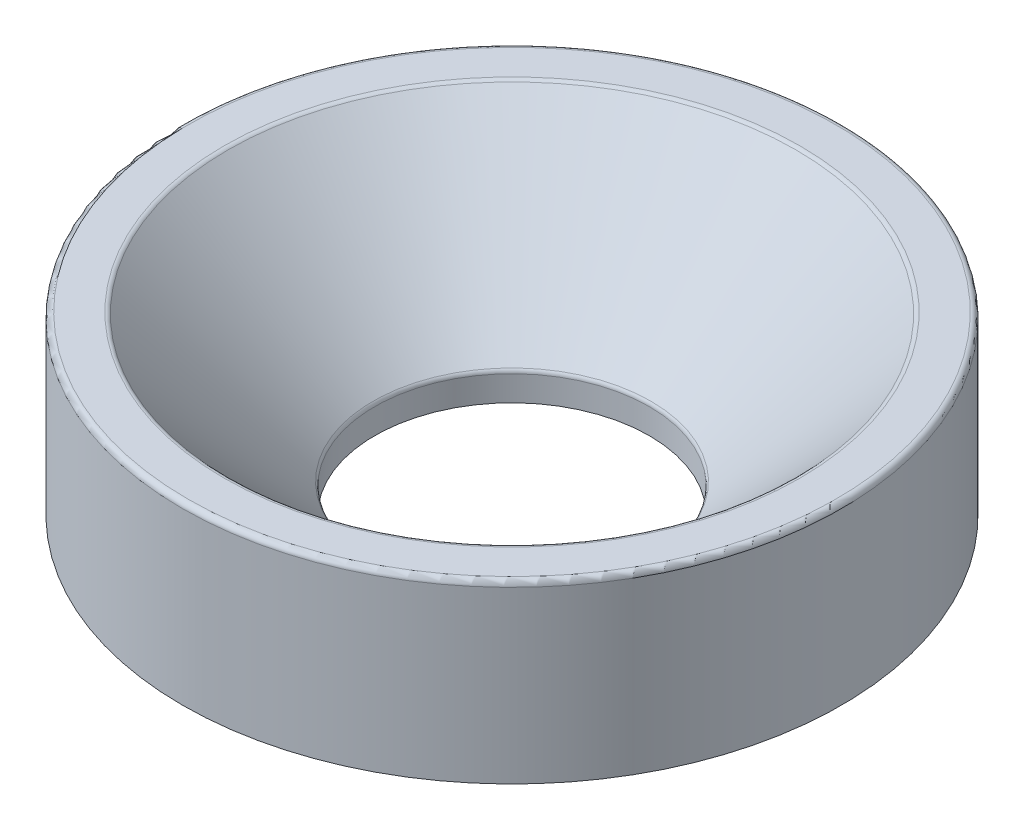
ISO-10303-21;
HEADER;
FILE_DESCRIPTION(('STEP AP214'),'2;1');
FILE_NAME('part.step','',(''),(''),'','','');
FILE_SCHEMA(('AUTOMOTIVE_DESIGN { 1 0 10303 214 1 1 1 1 }'));
ENDSEC;
DATA;
#1=APPLICATION_CONTEXT('core data for automotive mechanical design processes');
#2=APPLICATION_PROTOCOL_DEFINITION('international standard','automotive_design',2000,#1);
#3=PRODUCT_CONTEXT('',#1,'mechanical');
#4=PRODUCT('Part','Part','',(#3));
#5=PRODUCT_RELATED_PRODUCT_CATEGORY('part','',(#4));
#6=PRODUCT_DEFINITION_FORMATION('','',#4);
#7=PRODUCT_DEFINITION_CONTEXT('part definition',#1,'design');
#8=PRODUCT_DEFINITION('design','',#6,#7);
#9=PRODUCT_DEFINITION_SHAPE('','',#8);
#10=(LENGTH_UNIT() NAMED_UNIT(*) SI_UNIT(.MILLI.,.METRE.));
#11=(NAMED_UNIT(*) PLANE_ANGLE_UNIT() SI_UNIT($,.RADIAN.));
#12=(NAMED_UNIT(*) SI_UNIT($,.STERADIAN.) SOLID_ANGLE_UNIT());
#13=UNCERTAINTY_MEASURE_WITH_UNIT(LENGTH_MEASURE(1.E-05),#10,'distance_accuracy_value','');
#14=(GEOMETRIC_REPRESENTATION_CONTEXT(3) GLOBAL_UNCERTAINTY_ASSIGNED_CONTEXT((#13)) GLOBAL_UNIT_ASSIGNED_CONTEXT((#10,
#11,#12)) REPRESENTATION_CONTEXT('',''));
#15=CARTESIAN_POINT('',(0.,0.,0.));
#16=DIRECTION('',(0.,0.,1.));
#17=DIRECTION('',(1.,0.,0.));
#18=AXIS2_PLACEMENT_3D('',#15,#16,#17);
#19=CARTESIAN_POINT('',(0.,3.2,0.));
#20=DIRECTION('',(0.,1.,0.));
#21=DIRECTION('',(0.,0.,1.));
#22=AXIS2_PLACEMENT_3D('',#19,#20,#21);
#23=PLANE('',#22);
#24=CARTESIAN_POINT('',(0.,3.2,0.));
#25=DIRECTION('',(0.,1.,0.));
#26=DIRECTION('',(0.,0.,1.));
#27=AXIS2_PLACEMENT_3D('',#24,#25,#26);
#28=CIRCLE('',#27,5.9);
#29=CARTESIAN_POINT('',(0.,3.2,5.9));
#30=VERTEX_POINT('',#29);
#31=EDGE_CURVE('E65',#30,#30,#28,.T.);
#32=ORIENTED_EDGE('',*,*,#31,.T.);
#33=EDGE_LOOP('',(#32));
#34=FACE_BOUND('',#33,.T.);
#35=CARTESIAN_POINT('',(0.,3.2,0.));
#36=DIRECTION('',(0.,1.,0.));
#37=DIRECTION('',(0.,0.,1.));
#38=AXIS2_PLACEMENT_3D('',#35,#36,#37);
#39=CIRCLE('',#38,5.24142135623732);
#40=CARTESIAN_POINT('',(0.,3.2,5.24142135623732));
#41=VERTEX_POINT('',#40);
#42=EDGE_CURVE('E69',#41,#41,#39,.F.);
#43=ORIENTED_EDGE('',*,*,#42,.T.);
#44=EDGE_LOOP('',(#43));
#45=FACE_BOUND('',#44,.T.);
#46=ADVANCED_FACE('F41',(#34,#45),#23,.T.);
#47=CARTESIAN_POINT('',(0.,0.,0.));
#48=DIRECTION('',(0.,1.,0.));
#49=DIRECTION('',(0.,0.,1.));
#50=AXIS2_PLACEMENT_3D('',#47,#48,#49);
#51=PLANE('',#50);
#52=CARTESIAN_POINT('',(0.,0.,0.));
#53=DIRECTION('',(0.,1.,0.));
#54=DIRECTION('',(0.,0.,1.));
#55=AXIS2_PLACEMENT_3D('',#52,#53,#54);
#56=CIRCLE('',#55,6.);
#57=CARTESIAN_POINT('',(0.,0.,6.));
#58=VERTEX_POINT('',#57);
#59=EDGE_CURVE('E73',#58,#58,#56,.T.);
#60=ORIENTED_EDGE('',*,*,#59,.F.);
#61=EDGE_LOOP('',(#60));
#62=FACE_BOUND('',#61,.T.);
#63=CARTESIAN_POINT('',(0.,0.,0.));
#64=DIRECTION('',(0.,1.,0.));
#65=DIRECTION('',(0.,0.,1.));
#66=AXIS2_PLACEMENT_3D('',#63,#64,#65);
#67=CIRCLE('',#66,2.5);
#68=CARTESIAN_POINT('',(0.,0.,2.5));
#69=VERTEX_POINT('',#68);
#70=EDGE_CURVE('E77',#69,#69,#67,.T.);
#71=ORIENTED_EDGE('',*,*,#70,.T.);
#72=EDGE_LOOP('',(#71));
#73=FACE_BOUND('',#72,.T.);
#74=ADVANCED_FACE('F82',(#62,#73),#51,.F.);
#75=CARTESIAN_POINT('',(0.,3.2,0.));
#76=DIRECTION('',(0.,-1.,0.));
#77=DIRECTION('',(0.,0.,-1.));
#78=AXIS2_PLACEMENT_3D('',#75,#76,#77);
#79=CYLINDRICAL_SURFACE('',#78,6.);
#80=CARTESIAN_POINT('',(0.,3.1,0.));
#81=DIRECTION('',(0.,1.,0.));
#82=DIRECTION('',(0.,0.,1.));
#83=AXIS2_PLACEMENT_3D('',#80,#81,#82);
#84=CIRCLE('',#83,6.);
#85=CARTESIAN_POINT('',(0.,3.1,6.));
#86=VERTEX_POINT('',#85);
#87=EDGE_CURVE('E59',#86,#86,#84,.F.);
#88=ORIENTED_EDGE('',*,*,#87,.T.);
#89=EDGE_LOOP('',(#88));
#90=FACE_BOUND('',#89,.T.);
#91=ORIENTED_EDGE('',*,*,#59,.T.);
#92=EDGE_LOOP('',(#91));
#93=FACE_BOUND('',#92,.T.);
#94=ADVANCED_FACE('F87',(#90,#93),#79,.T.);
#95=CARTESIAN_POINT('',(0.,3.2,0.));
#96=DIRECTION('',(0.,-1.,0.));
#97=DIRECTION('',(0.,0.,-1.));
#98=AXIS2_PLACEMENT_3D('',#95,#96,#97);
#99=CYLINDRICAL_SURFACE('',#98,2.5);
#100=CARTESIAN_POINT('',(0.,0.458578643762691,0.));
#101=DIRECTION('',(0.,-1.,0.));
#102=DIRECTION('',(0.,0.,-1.));
#103=AXIS2_PLACEMENT_3D('',#100,#101,#102);
#104=CIRCLE('',#103,2.5);
#105=CARTESIAN_POINT('',(0.,0.458578643762691,-2.5));
#106=VERTEX_POINT('',#105);
#107=EDGE_CURVE('E10',#106,#106,#104,.F.);
#108=ORIENTED_EDGE('',*,*,#107,.T.);
#109=EDGE_LOOP('',(#108));
#110=FACE_BOUND('',#109,.T.);
#111=ORIENTED_EDGE('',*,*,#70,.F.);
#112=EDGE_LOOP('',(#111));
#113=FACE_BOUND('',#112,.T.);
#114=ADVANCED_FACE('F84',(#110,#113),#99,.F.);
#115=CARTESIAN_POINT('',(0.,0.500000000000001,0.));
#116=DIRECTION('',(0.,1.,0.));
#117=DIRECTION('',(0.,0.,1.));
#118=AXIS2_PLACEMENT_3D('',#115,#116,#117);
#119=CONICAL_SURFACE('',#118,2.5,0.78539816339745);
#120=CARTESIAN_POINT('',(0.,3.17071067811866,0.));
#121=DIRECTION('',(0.,-1.,0.));
#122=DIRECTION('',(0.,0.,-1.));
#123=AXIS2_PLACEMENT_3D('',#120,#121,#122);
#124=CIRCLE('',#123,5.17071067811866);
#125=CARTESIAN_POINT('',(0.,3.17071067811866,-5.17071067811866));
#126=VERTEX_POINT('',#125);
#127=EDGE_CURVE('E49',#126,#126,#124,.F.);
#128=ORIENTED_EDGE('',*,*,#127,.T.);
#129=EDGE_LOOP('',(#128));
#130=FACE_BOUND('',#129,.T.);
#131=CARTESIAN_POINT('',(0.,0.529289321881346,0.));
#132=DIRECTION('',(0.,-1.,0.));
#133=DIRECTION('',(0.,0.,-1.));
#134=AXIS2_PLACEMENT_3D('',#131,#132,#133);
#135=CIRCLE('',#134,2.52928932188135);
#136=CARTESIAN_POINT('',(0.,0.529289321881346,-2.52928932188135));
#137=VERTEX_POINT('',#136);
#138=EDGE_CURVE('E54',#137,#137,#135,.T.);
#139=ORIENTED_EDGE('',*,*,#138,.T.);
#140=EDGE_LOOP('',(#139));
#141=FACE_BOUND('',#140,.T.);
#142=ADVANCED_FACE('F86',(#130,#141),#119,.F.);
#143=CARTESIAN_POINT('',(0.,3.1,0.));
#144=DIRECTION('',(0.,1.,0.));
#145=DIRECTION('',(0.,0.,1.));
#146=AXIS2_PLACEMENT_3D('',#143,#144,#145);
#147=TOROIDAL_SURFACE('',#146,5.9,0.1);
#148=ORIENTED_EDGE('',*,*,#87,.F.);
#149=EDGE_LOOP('',(#148));
#150=FACE_BOUND('',#149,.T.);
#151=ORIENTED_EDGE('',*,*,#31,.F.);
#152=EDGE_LOOP('',(#151));
#153=FACE_BOUND('',#152,.T.);
#154=ADVANCED_FACE('F93',(#150,#153),#147,.T.);
#155=CARTESIAN_POINT('',(0.,3.1,0.));
#156=DIRECTION('',(0.,1.,0.));
#157=DIRECTION('',(0.,0.,1.));
#158=AXIS2_PLACEMENT_3D('',#155,#156,#157);
#159=TOROIDAL_SURFACE('',#158,5.24142135623732,0.1);
#160=ORIENTED_EDGE('',*,*,#127,.F.);
#161=EDGE_LOOP('',(#160));
#162=FACE_BOUND('',#161,.T.);
#163=ORIENTED_EDGE('',*,*,#42,.F.);
#164=EDGE_LOOP('',(#163));
#165=FACE_BOUND('',#164,.T.);
#166=ADVANCED_FACE('F111',(#162,#165),#159,.T.);
#167=CARTESIAN_POINT('',(0.,0.458578643762692,0.));
#168=DIRECTION('',(0.,-1.,0.));
#169=DIRECTION('',(0.,0.,-1.));
#170=AXIS2_PLACEMENT_3D('',#167,#168,#169);
#171=TOROIDAL_SURFACE('',#170,2.6,0.1);
#172=ORIENTED_EDGE('',*,*,#138,.F.);
#173=EDGE_LOOP('',(#172));
#174=FACE_BOUND('',#173,.T.);
#175=ORIENTED_EDGE('',*,*,#107,.F.);
#176=EDGE_LOOP('',(#175));
#177=FACE_BOUND('',#176,.T.);
#178=ADVANCED_FACE('F43',(#174,#177),#171,.T.);
#179=CLOSED_SHELL('',(#46,#74,#94,#114,#142,#154,#166,#178));
#180=MANIFOLD_SOLID_BREP('B2',#179);
#181=ADVANCED_BREP_SHAPE_REPRESENTATION('',(#18,#180),#14);
#182=SHAPE_DEFINITION_REPRESENTATION(#9,#181);
ENDSEC;
END-ISO-10303-21;
